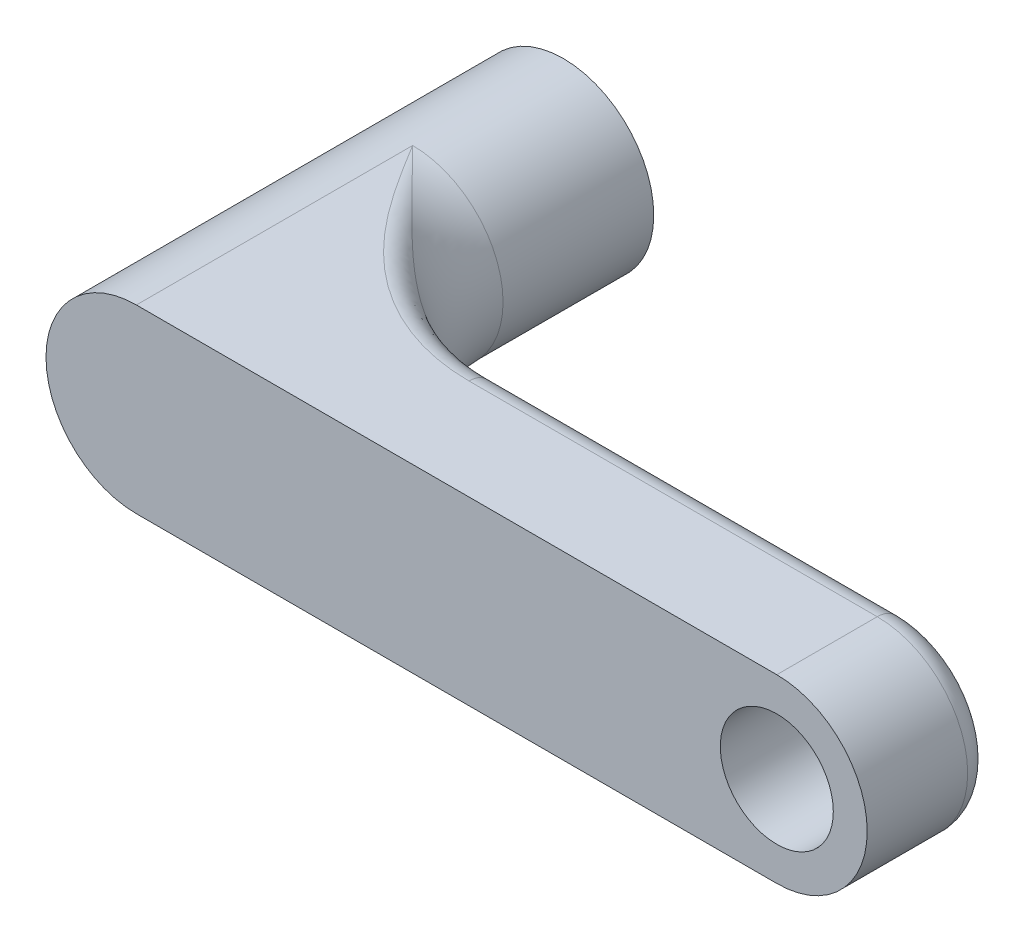
ISO-10303-21;
HEADER;
FILE_DESCRIPTION(('STEP AP214'),'2;1');
FILE_NAME('part.step','',(''),(''),'','','');
FILE_SCHEMA(('AUTOMOTIVE_DESIGN { 1 0 10303 214 1 1 1 1 }'));
ENDSEC;
DATA;
#1=APPLICATION_CONTEXT('core data for automotive mechanical design processes');
#2=APPLICATION_PROTOCOL_DEFINITION('international standard','automotive_design',2000,#1);
#3=PRODUCT_CONTEXT('',#1,'mechanical');
#4=PRODUCT('Part','Part','',(#3));
#5=PRODUCT_RELATED_PRODUCT_CATEGORY('part','',(#4));
#6=PRODUCT_DEFINITION_FORMATION('','',#4);
#7=PRODUCT_DEFINITION_CONTEXT('part definition',#1,'design');
#8=PRODUCT_DEFINITION('design','',#6,#7);
#9=PRODUCT_DEFINITION_SHAPE('','',#8);
#10=(LENGTH_UNIT() NAMED_UNIT(*) SI_UNIT(.MILLI.,.METRE.));
#11=(NAMED_UNIT(*) PLANE_ANGLE_UNIT() SI_UNIT($,.RADIAN.));
#12=(NAMED_UNIT(*) SI_UNIT($,.STERADIAN.) SOLID_ANGLE_UNIT());
#13=UNCERTAINTY_MEASURE_WITH_UNIT(LENGTH_MEASURE(1.E-05),#10,'distance_accuracy_value','');
#14=(GEOMETRIC_REPRESENTATION_CONTEXT(3) GLOBAL_UNCERTAINTY_ASSIGNED_CONTEXT((#13)) GLOBAL_UNIT_ASSIGNED_CONTEXT((#10,
#11,#12)) REPRESENTATION_CONTEXT('',''));
#15=CARTESIAN_POINT('',(0.,0.,0.));
#16=DIRECTION('',(0.,0.,1.));
#17=DIRECTION('',(1.,0.,0.));
#18=AXIS2_PLACEMENT_3D('',#15,#16,#17);
#19=CARTESIAN_POINT('',(0.,0.,17.));
#20=DIRECTION('',(0.,0.,-1.));
#21=DIRECTION('',(-1.,0.,0.));
#22=AXIS2_PLACEMENT_3D('',#19,#20,#21);
#23=CYLINDRICAL_SURFACE('',#22,3.6);
#24=CARTESIAN_POINT('',(0.,0.,0.));
#25=DIRECTION('',(0.,0.,1.));
#26=DIRECTION('',(1.,0.,0.));
#27=AXIS2_PLACEMENT_3D('',#24,#25,#26);
#28=CIRCLE('',#27,3.6);
#29=CARTESIAN_POINT('',(3.6,0.,0.));
#30=VERTEX_POINT('',#29);
#31=EDGE_CURVE('E140',#30,#30,#28,.T.);
#32=ORIENTED_EDGE('',*,*,#31,.T.);
#33=EDGE_LOOP('',(#32));
#34=FACE_BOUND('',#33,.T.);
#35=DIRECTION('',(0.,0.,1.));
#36=VECTOR('',#35,1.);
#37=CARTESIAN_POINT('',(0.,3.6,12.));
#38=LINE('',#37,#36);
#39=CARTESIAN_POINT('',(0.,3.6,6.));
#40=VERTEX_POINT('',#39);
#41=CARTESIAN_POINT('',(0.,3.6,17.));
#42=VERTEX_POINT('',#41);
#43=EDGE_CURVE('E133',#40,#42,#38,.T.);
#44=ORIENTED_EDGE('',*,*,#43,.F.);
#45=CARTESIAN_POINT('',(0.,0.,6.));
#46=DIRECTION('',(0.,0.,1.));
#47=DIRECTION('',(1.,0.,0.));
#48=AXIS2_PLACEMENT_3D('',#45,#46,#47);
#49=CIRCLE('',#48,3.6);
#50=CARTESIAN_POINT('',(0.,-3.6,6.));
#51=VERTEX_POINT('',#50);
#52=EDGE_CURVE('E148',#40,#51,#49,.F.);
#53=ORIENTED_EDGE('',*,*,#52,.T.);
#54=DIRECTION('',(0.,0.,1.));
#55=VECTOR('',#54,1.);
#56=CARTESIAN_POINT('',(0.,-3.6,12.));
#57=LINE('',#56,#55);
#58=CARTESIAN_POINT('',(0.,-3.6,17.));
#59=VERTEX_POINT('',#58);
#60=EDGE_CURVE('E130',#51,#59,#57,.T.);
#61=ORIENTED_EDGE('',*,*,#60,.T.);
#62=CARTESIAN_POINT('',(0.,0.,17.));
#63=DIRECTION('',(0.,0.,1.));
#64=DIRECTION('',(1.,0.,0.));
#65=AXIS2_PLACEMENT_3D('',#62,#63,#64);
#66=CIRCLE('',#65,3.6);
#67=EDGE_CURVE('E121',#42,#59,#66,.T.);
#68=ORIENTED_EDGE('',*,*,#67,.F.);
#69=EDGE_LOOP('',(#44,#53,#61,#68));
#70=FACE_BOUND('',#69,.T.);
#71=ADVANCED_FACE('F37',(#34,#70),#23,.T.);
#72=CARTESIAN_POINT('',(0.,0.,17.));
#73=DIRECTION('',(0.,0.,1.));
#74=DIRECTION('',(1.,0.,0.));
#75=AXIS2_PLACEMENT_3D('',#72,#73,#74);
#76=PLANE('',#75);
#77=CARTESIAN_POINT('',(25.5,0.,17.));
#78=DIRECTION('',(0.,0.,1.));
#79=DIRECTION('',(1.,0.,0.));
#80=AXIS2_PLACEMENT_3D('',#77,#78,#79);
#81=CIRCLE('',#80,2.25);
#82=CARTESIAN_POINT('',(27.75,0.,17.));
#83=VERTEX_POINT('',#82);
#84=EDGE_CURVE('E125',#83,#83,#81,.T.);
#85=ORIENTED_EDGE('',*,*,#84,.F.);
#86=EDGE_LOOP('',(#85));
#87=FACE_BOUND('',#86,.T.);
#88=ORIENTED_EDGE('',*,*,#67,.T.);
#89=DIRECTION('',(1.,0.,0.));
#90=VECTOR('',#89,1.);
#91=CARTESIAN_POINT('',(0.,-3.6,17.));
#92=LINE('',#91,#90);
#93=CARTESIAN_POINT('',(25.5,-3.6,17.));
#94=VERTEX_POINT('',#93);
#95=EDGE_CURVE('E103',#59,#94,#92,.T.);
#96=ORIENTED_EDGE('',*,*,#95,.T.);
#97=CARTESIAN_POINT('',(25.5,0.,17.));
#98=DIRECTION('',(0.,0.,1.));
#99=DIRECTION('',(1.,0.,0.));
#100=AXIS2_PLACEMENT_3D('',#97,#98,#99);
#101=CIRCLE('',#100,3.6);
#102=CARTESIAN_POINT('',(25.5,3.6,17.));
#103=VERTEX_POINT('',#102);
#104=EDGE_CURVE('E112',#94,#103,#101,.T.);
#105=ORIENTED_EDGE('',*,*,#104,.T.);
#106=DIRECTION('',(-1.,0.,0.));
#107=VECTOR('',#106,1.);
#108=CARTESIAN_POINT('',(0.,3.6,17.));
#109=LINE('',#108,#107);
#110=EDGE_CURVE('E109',#103,#42,#109,.T.);
#111=ORIENTED_EDGE('',*,*,#110,.T.);
#112=EDGE_LOOP('',(#88,#96,#105,#111));
#113=FACE_BOUND('',#112,.T.);
#114=ADVANCED_FACE('F119',(#87,#113),#76,.T.);
#115=CARTESIAN_POINT('',(0.,0.,0.));
#116=DIRECTION('',(0.,0.,1.));
#117=DIRECTION('',(1.,0.,0.));
#118=AXIS2_PLACEMENT_3D('',#115,#116,#117);
#119=PLANE('',#118);
#120=CARTESIAN_POINT('',(0.,0.,0.));
#121=DIRECTION('',(0.,0.,-1.));
#122=DIRECTION('',(-1.,0.,0.));
#123=AXIS2_PLACEMENT_3D('',#120,#121,#122);
#124=CIRCLE('',#123,2.125);
#125=CARTESIAN_POINT('',(-2.125,0.,0.));
#126=VERTEX_POINT('',#125);
#127=EDGE_CURVE('E132',#126,#126,#124,.T.);
#128=ORIENTED_EDGE('',*,*,#127,.F.);
#129=EDGE_LOOP('',(#128));
#130=FACE_BOUND('',#129,.T.);
#131=ORIENTED_EDGE('',*,*,#31,.F.);
#132=EDGE_LOOP('',(#131));
#133=FACE_BOUND('',#132,.T.);
#134=ADVANCED_FACE('F278',(#130,#133),#119,.F.);
#135=CARTESIAN_POINT('',(0.,0.,10.));
#136=DIRECTION('',(0.,0.,-1.));
#137=DIRECTION('',(-1.,0.,0.));
#138=AXIS2_PLACEMENT_3D('',#135,#136,#137);
#139=CYLINDRICAL_SURFACE('',#138,2.125);
#140=CARTESIAN_POINT('',(0.,0.,10.));
#141=DIRECTION('',(0.,0.,-1.));
#142=DIRECTION('',(-1.,0.,0.));
#143=AXIS2_PLACEMENT_3D('',#140,#141,#142);
#144=CIRCLE('',#143,2.125);
#145=CARTESIAN_POINT('',(-2.125,0.,10.));
#146=VERTEX_POINT('',#145);
#147=EDGE_CURVE('E137',#146,#146,#144,.T.);
#148=ORIENTED_EDGE('',*,*,#147,.F.);
#149=EDGE_LOOP('',(#148));
#150=FACE_BOUND('',#149,.T.);
#151=ORIENTED_EDGE('',*,*,#127,.T.);
#152=EDGE_LOOP('',(#151));
#153=FACE_BOUND('',#152,.T.);
#154=ADVANCED_FACE('F283',(#150,#153),#139,.F.);
#155=CARTESIAN_POINT('',(0.,0.,10.));
#156=DIRECTION('',(0.,0.,-1.));
#157=DIRECTION('',(-1.,0.,0.));
#158=AXIS2_PLACEMENT_3D('',#155,#156,#157);
#159=PLANE('',#158);
#160=ORIENTED_EDGE('',*,*,#147,.T.);
#161=EDGE_LOOP('',(#160));
#162=FACE_BOUND('',#161,.T.);
#163=ADVANCED_FACE('F227',(#162),#159,.T.);
#164=CARTESIAN_POINT('',(0.,-3.6,12.));
#165=DIRECTION('',(0.,-1.,0.));
#166=DIRECTION('',(0.,0.,-1.));
#167=AXIS2_PLACEMENT_3D('',#164,#165,#166);
#168=PLANE('',#167);
#169=ORIENTED_EDGE('',*,*,#60,.F.);
#170=CARTESIAN_POINT('',(11.6412120417183,-3.6,12.6015371164591));
#171=CARTESIAN_POINT('',(11.2912651128014,-3.6,11.5847507329851));
#172=CARTESIAN_POINT('',(11.3166337319736,-2.52750723873836,11.6584603855364));
#173=CARTESIAN_POINT('',(11.4482937655129,-3.6,12.6679578156769));
#174=CARTESIAN_POINT('',(11.1291071294746,-3.6,11.6459425281579));
#175=CARTESIAN_POINT('',(11.1502197619842,-2.53222750770992,11.715392413507));
#176=CARTESIAN_POINT('',(11.2525716817974,-3.6,12.726160517677));
#177=CARTESIAN_POINT('',(10.9637922565761,-3.6,11.700776460458));
#178=CARTESIAN_POINT('',(10.9813154174639,-2.53723095128361,11.7652804437655));
#179=CARTESIAN_POINT('',(10.8569912389186,-3.6,12.8259613073396));
#180=CARTESIAN_POINT('',(10.6284403417357,-3.6,11.7970608108624));
#181=CARTESIAN_POINT('',(10.6397433170531,-2.54787660266658,11.8508239776751));
#182=CARTESIAN_POINT('',(10.6571339884089,-3.6,12.8675637864313));
#183=CARTESIAN_POINT('',(10.4585366993953,-3.6,11.8385595434334));
#184=CARTESIAN_POINT('',(10.4670765692337,-2.5535186410341,11.8864832454083));
#185=CARTESIAN_POINT('',(10.2552608958121,-3.6,12.9339301047296));
#186=CARTESIAN_POINT('',(10.1155016303926,-3.6,11.9078719973684));
#187=CARTESIAN_POINT('',(10.1196350187709,-2.56549813488844,11.9433686611022));
#188=CARTESIAN_POINT('',(10.0532534328453,-3.6,12.9587446013689));
#189=CARTESIAN_POINT('',(9.94252402811078,-3.6,11.9357864132296));
#190=CARTESIAN_POINT('',(9.94486819225055,-2.57183343065732,11.9646382297191));
#191=CARTESIAN_POINT('',(9.64793000681871,-3.6,12.9917857817084));
#192=CARTESIAN_POINT('',(9.59387983761504,-3.6,11.9780116128161));
#193=CARTESIAN_POINT('',(9.5938942673513,-2.58529660171234,11.9929592414901));
#194=CARTESIAN_POINT('',(9.444613988823,-3.6,13.0000117643709));
#195=CARTESIAN_POINT('',(9.41835929884499,-3.6,11.9923992748455));
#196=CARTESIAN_POINT('',(9.41768710841925,-2.59242451048122,12.0000100837547));
#197=CARTESIAN_POINT('',(8.83483384377437,-3.6,12.9999764958797));
#198=CARTESIAN_POINT('',(8.89127716954358,-3.6,12.0150143944));
#199=CARTESIAN_POINT('',(8.88863124979969,-2.61513512443222,11.9999798535948));
#200=CARTESIAN_POINT('',(8.42811264837613,-3.6,12.9670709300723));
#201=CARTESIAN_POINT('',(8.53577811718981,-3.6,12.0035261501664));
#202=CARTESIAN_POINT('',(8.53498106842948,-2.63205682688977,11.9717750829234));
#203=CARTESIAN_POINT('',(7.62487730077073,-3.6,12.838385798667));
#204=CARTESIAN_POINT('',(7.82438166460575,-3.6,11.926473340687));
#205=CARTESIAN_POINT('',(7.83409683489685,-2.67033265705266,11.8614735417249));
#206=CARTESIAN_POINT('',(7.22836882818254,-3.6,12.7425720002668));
#207=CARTESIAN_POINT('',(7.46978427415438,-3.6,11.8619864766528));
#208=CARTESIAN_POINT('',(7.48686638199672,-2.69168919373504,11.7793474287958));
#209=CARTESIAN_POINT('',(6.4239252948628,-3.6,12.4833214447656));
#210=CARTESIAN_POINT('',(6.73954607399357,-3.6,11.6740886579743));
#211=CARTESIAN_POINT('',(6.77832319923892,-2.74175144424244,11.5571326669465));
#212=CARTESIAN_POINT('',(6.01750243782565,-3.6,12.3152023195919));
#213=CARTESIAN_POINT('',(6.36535616115251,-3.6,11.5480910826563));
#214=CARTESIAN_POINT('',(6.41801754417853,-2.77089975161888,11.4130305596814));
#215=CARTESIAN_POINT('',(5.23459827002132,-3.6,11.919973236659));
#216=CARTESIAN_POINT('',(5.62977395264859,-3.6,11.2394549136101));
#217=CARTESIAN_POINT('',(5.71647677637085,-2.83688604075511,11.0742627742844));
#218=CARTESIAN_POINT('',(4.85812405903247,-3.6,11.6928493450441));
#219=CARTESIAN_POINT('',(5.26992355997416,-3.6,11.0591013379251));
#220=CARTESIAN_POINT('',(5.37524619132276,-2.87372583844066,10.8795851528479));
#221=CARTESIAN_POINT('',(4.23856373501726,-3.6,11.2587545818777));
#222=CARTESIAN_POINT('',(4.66153658264882,-3.6,10.7024223473949));
#223=CARTESIAN_POINT('',(4.80324893832798,-2.94455369864078,10.5075039273579));
#224=CARTESIAN_POINT('',(3.98721617272842,-3.6,11.0633457948435));
#225=CARTESIAN_POINT('',(4.41196237680684,-3.6,10.5408209750544));
#226=CARTESIAN_POINT('',(4.56785721558966,-2.97655195738627,10.3400106814151));
#227=CARTESIAN_POINT('',(3.50308874934244,-3.6,10.6505994635073));
#228=CARTESIAN_POINT('',(3.92292499212783,-3.6,10.1935983868694));
#229=CARTESIAN_POINT('',(4.10553017674361,-3.04478027454322,9.9862281116887));
#230=CARTESIAN_POINT('',(3.27031682107747,-3.6,10.4332526392295));
#231=CARTESIAN_POINT('',(3.68372550515986,-3.6,10.0088880422756));
#232=CARTESIAN_POINT('',(3.87859849535623,-3.08101212483007,9.79993083363999));
#233=CARTESIAN_POINT('',(2.82264474579318,-3.6,9.98040297096917));
#234=CARTESIAN_POINT('',(3.21561514967119,-3.6,9.61828272177543));
#235=CARTESIAN_POINT('',(3.43028102863137,-3.1567054648508,9.41177397510173));
#236=CARTESIAN_POINT('',(2.60777073969791,-3.6,9.74487450592369));
#237=CARTESIAN_POINT('',(2.98671490683455,-3.6,9.41307946637038));
#238=CARTESIAN_POINT('',(3.20890367416878,-3.19617151713573,9.20989243370131));
#239=CARTESIAN_POINT('',(2.19464881792116,-3.6,9.25983355437357));
#240=CARTESIAN_POINT('',(2.53926687584139,-3.6,8.98521273501958));
#241=CARTESIAN_POINT('',(2.76838754457269,-3.27596486263584,8.79414304667419));
#242=CARTESIAN_POINT('',(1.99639838653591,-3.6,9.01032319336727));
#243=CARTESIAN_POINT('',(2.32038858670714,-3.6,8.76288850920592));
#244=CARTESIAN_POINT('',(2.54924843514175,-3.31629202437319,8.58027702290321));
#245=CARTESIAN_POINT('',(1.64120125811175,-3.6,8.53729477137819));
#246=CARTESIAN_POINT('',(1.92200834941239,-3.6,8.33687400387407));
#247=CARTESIAN_POINT('',(2.1409522526286,-3.38837575776188,8.17482408973818));
#248=CARTESIAN_POINT('',(1.48239949195397,-3.6,8.31515420588447));
#249=CARTESIAN_POINT('',(1.7413906393472,-3.6,8.13545298202036));
#250=CARTESIAN_POINT('',(1.95198327355678,-3.42053378517336,7.98441789075422));
#251=CARTESIAN_POINT('',(1.17311047645076,-3.6,7.8655960482988));
#252=CARTESIAN_POINT('',(1.38619920261624,-3.6,7.72570977142303));
#253=CARTESIAN_POINT('',(1.57162800523901,-3.47937578101068,7.59908232711715));
#254=CARTESIAN_POINT('',(1.02261326902235,-3.6,7.6381852620691));
#255=CARTESIAN_POINT('',(1.21094996811423,-3.6,7.51684217741283));
#256=CARTESIAN_POINT('',(1.38024496480471,-3.50606641445934,7.40415879606027));
#257=CARTESIAN_POINT('',(0.726742216698949,-3.6,7.17896301466725));
#258=CARTESIAN_POINT('',(0.864340906581319,-3.6,7.09406183847125));
#259=CARTESIAN_POINT('',(0.993775974669483,-3.55076616775441,7.0105397268566));
#260=CARTESIAN_POINT('',(0.581388107061622,-3.6,6.94713895516303));
#261=CARTESIAN_POINT('',(0.69211876155406,-3.6,6.87917605407218));
#262=CARTESIAN_POINT('',(0.798679424581684,-3.56874463292702,6.81183339013947));
#263=CARTESIAN_POINT('',(0.29358144924814,-3.6,6.48164549304636));
#264=CARTESIAN_POINT('',(0.35055500340188,-3.6,6.44790584017823));
#265=CARTESIAN_POINT('',(0.406418984095753,-3.59323222815295,6.41283899404));
#266=CARTESIAN_POINT('',(0.151129509375175,-3.6,6.24797571752396));
#267=CARTESIAN_POINT('',(0.180203095904452,-3.6,6.23027632014203));
#268=CARTESIAN_POINT('',(0.209254673144227,-3.59973897765836,6.21255061502054));
#269=CARTESIAN_POINT('',(0.0058054885505426,-3.6,6.00952579316415));
#270=CARTESIAN_POINT('',(0.00692193721074341,-3.6,6.00884539275747));
#271=CARTESIAN_POINT('',(0.00803837448457479,-3.59999747097945,6.00816496556927));
#272=CARTESIAN_POINT('',(0.00290274398119086,-3.6,6.00476289643463));
#273=CARTESIAN_POINT('',(0.00346096827214912,-3.6,6.00442269758404));
#274=CARTESIAN_POINT('',(0.00401918990586023,-3.60000003652135,6.00408248265826));
#275=CARTESIAN_POINT('',(0.,-3.6,6.));
#276=CARTESIAN_POINT('',(0.,-3.6,6.));
#277=CARTESIAN_POINT('',(0.,-3.6,6.));
#278=(BOUNDED_SURFACE() B_SPLINE_SURFACE(3,2,((#170,#171,#172),(#173,#174,#175),(#176,#177,
#178),(#179,#180,#181),(#182,#183,#184),(#185,#186,#187),(#188,#189,#190),(#191,#192,#193),
(#194,#195,#196),(#197,#198,#199),(#200,#201,#202),(#203,#204,#205),(#206,#207,#208),(#209,#210,
#211),(#212,#213,#214),(#215,#216,#217),(#218,#219,#220),(#221,#222,#223),(#224,#225,#226),
(#227,#228,#229),(#230,#231,#232),(#233,#234,#235),(#236,#237,#238),(#239,#240,#241),(#242,#243,
#244),(#245,#246,#247),(#248,#249,#250),(#251,#252,#253),(#254,#255,#256),(#257,#258,#259),
(#260,#261,#262),(#263,#264,#265),(#266,#267,#268),(#269,#270,#271),(#272,#273,#274),(#275,#276,
#277)),.UNSPECIFIED.,.F.,.F.,.F.) B_SPLINE_SURFACE_WITH_KNOTS((4,2,2,2,2,2,2,2,2,2,2,2,2,2,2,2,
2,4),(3,3),(0.,0.611876128867008,1.22359028430795,1.83345027086995,2.44333602983645,
3.66183112886795,4.88098984711946,6.19502796610971,7.50937667504031,8.46318512461765,
9.41739874774759,10.3729824697153,11.3284213178725,12.1473977405228,12.9653697698198,
13.786199389849,14.6071993239279,14.6239325244586),(0.,1.),
.UNSPECIFIED.) GEOMETRIC_REPRESENTATION_ITEM() RATIONAL_B_SPLINE_SURFACE(((1.,0.680994581013081,
1.),(1.,0.682727209185336,1.),(1.,0.684557631714779,1.),(1.,0.688434558323677,1.),(1.,
0.690481005074613,1.),(1.,0.69480480515907,1.),(1.,0.697081439788944,1.),(1.,0.701893196281024,
1.),(1.,0.704428329062716,1.),(1.,0.712458079750084,1.),(1.,0.718381456508078,1.),(1.,
0.73158043402025,1.),(1.,0.738856769468396,1.),(1.,0.755613397418577,1.),(1.,0.765221140645199,
1.),(1.,0.786483016770302,1.),(1.,0.798137632822745,1.),(1.,0.819976060656735,1.),(1.,
0.829686361058553,1.),(1.,0.849995820714118,1.),(1.,0.860595355798884,1.),(1.,0.882309572248317,
1.),(1.,0.893424971428611,1.),(1.,0.915479774597461,1.),(1.,0.92641920501275,1.),(1.,
0.945657115723121,1.),(1.,0.954109635541874,1.),(1.,0.96940526318967,1.),(1.,0.976250332089803,
1.),(1.,0.987631687780218,1.),(1.,0.992159825283573,1.),(1.,0.998311692059242,1.),(1.,
0.999934818500551,1.),(1.,0.999999366232993,1.),(1.,1.0000000075569,1.),(1.,1.,1.))) REPRESENTATION_ITEM('') SURFACE());
#279=CARTESIAN_POINT('',(11.6412120417183,-3.6,12.6015371164591));
#280=CARTESIAN_POINT('',(11.4482937655129,-3.6,12.6679578156769));
#281=CARTESIAN_POINT('',(11.2525716817974,-3.6,12.726160517677));
#282=CARTESIAN_POINT('',(10.8569912389186,-3.6,12.8259613073396));
#283=CARTESIAN_POINT('',(10.6571339884089,-3.6,12.8675637864313));
#284=CARTESIAN_POINT('',(10.2552608958121,-3.6,12.9339301047296));
#285=CARTESIAN_POINT('',(10.0532534328453,-3.6,12.9587446013689));
#286=CARTESIAN_POINT('',(9.64793000681871,-3.6,12.9917857817084));
#287=CARTESIAN_POINT('',(9.444613988823,-3.6,13.0000117643709));
#288=CARTESIAN_POINT('',(8.83483384377436,-3.6,12.9999764958797));
#289=CARTESIAN_POINT('',(8.42811264837613,-3.6,12.9670709300723));
#290=CARTESIAN_POINT('',(7.62487730077073,-3.6,12.838385798667));
#291=CARTESIAN_POINT('',(7.22836882818254,-3.6,12.7425720002668));
#292=CARTESIAN_POINT('',(6.4239252948628,-3.6,12.4833214447656));
#293=CARTESIAN_POINT('',(6.01750243782565,-3.6,12.3152023195919));
#294=CARTESIAN_POINT('',(5.23459827002132,-3.6,11.919973236659));
#295=CARTESIAN_POINT('',(4.85812405903246,-3.6,11.6928493450441));
#296=CARTESIAN_POINT('',(4.23856373501726,-3.6,11.2587545818777));
#297=CARTESIAN_POINT('',(3.98721617272842,-3.6,11.0633457948435));
#298=CARTESIAN_POINT('',(3.50308874934244,-3.6,10.6505994635074));
#299=CARTESIAN_POINT('',(3.27031682107747,-3.6,10.4332526392295));
#300=CARTESIAN_POINT('',(2.82264474579318,-3.6,9.98040297096917));
#301=CARTESIAN_POINT('',(2.60777073969791,-3.6,9.74487450592369));
#302=CARTESIAN_POINT('',(2.19464881792116,-3.6,9.25983355437357));
#303=CARTESIAN_POINT('',(1.99639838653591,-3.6,9.01032319336727));
#304=CARTESIAN_POINT('',(1.64120125811175,-3.6,8.53729477137819));
#305=CARTESIAN_POINT('',(1.48239949195397,-3.6,8.31515420588447));
#306=CARTESIAN_POINT('',(1.17311047645076,-3.6,7.8655960482988));
#307=CARTESIAN_POINT('',(1.02261326902235,-3.6,7.6381852620691));
#308=CARTESIAN_POINT('',(0.726742216698948,-3.6,7.17896301466725));
#309=CARTESIAN_POINT('',(0.581388107061622,-3.6,6.94713895516302));
#310=CARTESIAN_POINT('',(0.293581449248141,-3.6,6.48164549304636));
#311=CARTESIAN_POINT('',(0.151129509375177,-3.6,6.24797571752397));
#312=CARTESIAN_POINT('',(0.0058054885505426,-3.6,6.00952579316415));
#313=CARTESIAN_POINT('',(0.00290274398119086,-3.6,6.00476289643463));
#314=CARTESIAN_POINT('',(0.,-3.6,6.));
#315=B_SPLINE_CURVE_WITH_KNOTS('',3,(#279,#280,#281,#282,#283,#284,#285,#286,#287,#288,#289,
#290,#291,#292,#293,#294,#295,#296,#297,#298,#299,#300,#301,#302,#303,#304,#305,#306,#307,#308,
#309,#310,#311,#312,#313,#314),.UNSPECIFIED.,.F.,.F.,(4,2,2,2,2,2,2,2,2,2,2,2,2,2,2,2,2,4),(0.,
0.611876128867008,1.22359028430795,1.83345027086995,2.44333602983645,3.66183112886795,
4.88098984711946,6.19502796610971,7.50937667504031,8.46318512461765,9.41739874774759,
10.3729824697153,11.3284213178725,12.1473977405228,12.9653697698198,13.786199389849,
14.6071993239279,14.6239325244586),.UNSPECIFIED.);
#316=CARTESIAN_POINT('',(9.24121204171834,-3.6,13.));
#317=VERTEX_POINT('',#316);
#318=EDGE_CURVE('E11',#51,#317,#315,.F.);
#319=ORIENTED_EDGE('',*,*,#318,.T.);
#320=DIRECTION('',(1.,0.,0.));
#321=VECTOR('',#320,1.);
#322=CARTESIAN_POINT('',(25.5,-3.6,13.));
#323=LINE('',#322,#321);
#324=CARTESIAN_POINT('',(25.5,-3.6,13.));
#325=VERTEX_POINT('',#324);
#326=EDGE_CURVE('E49',#317,#325,#323,.T.);
#327=ORIENTED_EDGE('',*,*,#326,.T.);
#328=DIRECTION('',(0.,0.,1.));
#329=VECTOR('',#328,1.);
#330=CARTESIAN_POINT('',(25.5,-3.6,12.));
#331=LINE('',#330,#329);
#332=EDGE_CURVE('E99',#325,#94,#331,.T.);
#333=ORIENTED_EDGE('',*,*,#332,.T.);
#334=ORIENTED_EDGE('',*,*,#95,.F.);
#335=EDGE_LOOP('',(#169,#319,#327,#333,#334));
#336=FACE_BOUND('',#335,.T.);
#337=ADVANCED_FACE('F101',(#336),#168,.T.);
#338=CARTESIAN_POINT('',(0.,3.6,12.));
#339=DIRECTION('',(0.,1.,0.));
#340=DIRECTION('',(-1.,0.,0.));
#341=AXIS2_PLACEMENT_3D('',#338,#339,#340);
#342=PLANE('',#341);
#343=DIRECTION('',(-1.,0.,0.));
#344=VECTOR('',#343,1.);
#345=CARTESIAN_POINT('',(8.89943818451479,3.6,13.));
#346=LINE('',#345,#344);
#347=CARTESIAN_POINT('',(25.5,3.6,13.));
#348=VERTEX_POINT('',#347);
#349=CARTESIAN_POINT('',(9.24121204171834,3.6,13.));
#350=VERTEX_POINT('',#349);
#351=EDGE_CURVE('E151',#348,#350,#346,.T.);
#352=ORIENTED_EDGE('',*,*,#351,.T.);
#353=CARTESIAN_POINT('',(11.3166337319736,2.52750723873836,11.6584603855364));
#354=CARTESIAN_POINT('',(11.2912651128014,3.6,11.5847507329851));
#355=CARTESIAN_POINT('',(11.6412120417183,3.6,12.6015371164591));
#356=CARTESIAN_POINT('',(11.1502197619842,2.53222750770992,11.715392413507));
#357=CARTESIAN_POINT('',(11.1291071294746,3.6,11.6459425281579));
#358=CARTESIAN_POINT('',(11.4482937655129,3.6,12.6679578156769));
#359=CARTESIAN_POINT('',(10.9813154174639,2.53723095128361,11.7652804437655));
#360=CARTESIAN_POINT('',(10.9637922565761,3.6,11.700776460458));
#361=CARTESIAN_POINT('',(11.2525716817974,3.6,12.726160517677));
#362=CARTESIAN_POINT('',(10.639743317053,2.54787660266658,11.8508239776751));
#363=CARTESIAN_POINT('',(10.6284403417357,3.6,11.7970608108624));
#364=CARTESIAN_POINT('',(10.8569912389186,3.6,12.8259613073396));
#365=CARTESIAN_POINT('',(10.4670765692337,2.55351864103411,11.8864832454083));
#366=CARTESIAN_POINT('',(10.4585366993953,3.6,11.8385595434334));
#367=CARTESIAN_POINT('',(10.6571339884089,3.6,12.8675637864313));
#368=CARTESIAN_POINT('',(10.1196350187709,2.56549813488844,11.9433686611022));
#369=CARTESIAN_POINT('',(10.1155016303925,3.6,11.9078719973684));
#370=CARTESIAN_POINT('',(10.2552608958121,3.6,12.9339301047296));
#371=CARTESIAN_POINT('',(9.94486819225054,2.57183343065732,11.9646382297191));
#372=CARTESIAN_POINT('',(9.94252402811077,3.6,11.9357864132296));
#373=CARTESIAN_POINT('',(10.0532534328453,3.6,12.9587446013689));
#374=CARTESIAN_POINT('',(9.5938942673513,2.58529660171234,11.9929592414901));
#375=CARTESIAN_POINT('',(9.59387983761504,3.6,11.9780116128161));
#376=CARTESIAN_POINT('',(9.64793000681871,3.6,12.9917857817084));
#377=CARTESIAN_POINT('',(9.41768710841924,2.59242451048122,12.0000100837547));
#378=CARTESIAN_POINT('',(9.41835929884499,3.6,11.9923992748455));
#379=CARTESIAN_POINT('',(9.444613988823,3.6,13.0000117643709));
#380=CARTESIAN_POINT('',(8.88863124979969,2.61513512443222,11.9999798535948));
#381=CARTESIAN_POINT('',(8.89127716954359,3.6,12.0150143944));
#382=CARTESIAN_POINT('',(8.83483384377437,3.6,12.9999764958797));
#383=CARTESIAN_POINT('',(8.53498106842949,2.63205682688977,11.9717750829234));
#384=CARTESIAN_POINT('',(8.53577811718982,3.6,12.0035261501664));
#385=CARTESIAN_POINT('',(8.42811264837613,3.6,12.9670709300723));
#386=CARTESIAN_POINT('',(7.83409683489685,2.67033265705267,11.8614735417249));
#387=CARTESIAN_POINT('',(7.82438166460576,3.6,11.926473340687));
#388=CARTESIAN_POINT('',(7.62487730077074,3.6,12.838385798667));
#389=CARTESIAN_POINT('',(7.48686638199672,2.69168919373504,11.7793474287958));
#390=CARTESIAN_POINT('',(7.46978427415439,3.6,11.8619864766528));
#391=CARTESIAN_POINT('',(7.22836882818255,3.6,12.7425720002668));
#392=CARTESIAN_POINT('',(6.77832319923891,2.74175144424244,11.5571326669465));
#393=CARTESIAN_POINT('',(6.73954607399356,3.6,11.6740886579743));
#394=CARTESIAN_POINT('',(6.4239252948628,3.6,12.4833214447656));
#395=CARTESIAN_POINT('',(6.41801754417852,2.77089975161888,11.4130305596814));
#396=CARTESIAN_POINT('',(6.36535616115249,3.6,11.5480910826563));
#397=CARTESIAN_POINT('',(6.01750243782564,3.6,12.3152023195919));
#398=CARTESIAN_POINT('',(5.71647677637084,2.83688604075511,11.0742627742844));
#399=CARTESIAN_POINT('',(5.62977395264857,3.6,11.2394549136101));
#400=CARTESIAN_POINT('',(5.2345982700213,3.6,11.919973236659));
#401=CARTESIAN_POINT('',(5.37524619132275,2.87372583844066,10.8795851528479));
#402=CARTESIAN_POINT('',(5.26992355997415,3.6,11.0591013379251));
#403=CARTESIAN_POINT('',(4.85812405903246,3.6,11.6928493450441));
#404=CARTESIAN_POINT('',(4.80324893832799,2.94455369864078,10.5075039273579));
#405=CARTESIAN_POINT('',(4.66153658264883,3.6,10.7024223473949));
#406=CARTESIAN_POINT('',(4.23856373501727,3.6,11.2587545818777));
#407=CARTESIAN_POINT('',(4.56785721558968,2.97655195738627,10.3400106814151));
#408=CARTESIAN_POINT('',(4.41196237680686,3.6,10.5408209750545));
#409=CARTESIAN_POINT('',(3.98721617272844,3.6,11.0633457948435));
#410=CARTESIAN_POINT('',(4.10553017674365,3.04478027454321,9.98622811168873));
#411=CARTESIAN_POINT('',(3.92292499212786,3.6,10.1935983868694));
#412=CARTESIAN_POINT('',(3.50308874934247,3.6,10.6505994635074));
#413=CARTESIAN_POINT('',(3.87859849535627,3.08101212483007,9.79993083364002));
#414=CARTESIAN_POINT('',(3.6837255051599,3.6,10.0088880422756));
#415=CARTESIAN_POINT('',(3.27031682107751,3.6,10.4332526392296));
#416=CARTESIAN_POINT('',(3.43028102863141,3.15670546485079,9.41177397510176));
#417=CARTESIAN_POINT('',(3.21561514967123,3.6,9.61828272177546));
#418=CARTESIAN_POINT('',(2.82264474579322,3.6,9.98040297096921));
#419=CARTESIAN_POINT('',(3.20890367416881,3.19617151713572,9.20989243370134));
#420=CARTESIAN_POINT('',(2.98671490683458,3.6,9.41307946637041));
#421=CARTESIAN_POINT('',(2.60777073969794,3.6,9.74487450592372));
#422=CARTESIAN_POINT('',(2.76838754457269,3.27596486263584,8.7941430466742));
#423=CARTESIAN_POINT('',(2.5392668758414,3.6,8.98521273501959));
#424=CARTESIAN_POINT('',(2.19464881792117,3.6,9.25983355437359));
#425=CARTESIAN_POINT('',(2.54924843514173,3.31629202437319,8.58027702290323));
#426=CARTESIAN_POINT('',(2.32038858670711,3.6,8.76288850920594));
#427=CARTESIAN_POINT('',(1.9963983865359,3.6,9.01032319336729));
#428=CARTESIAN_POINT('',(2.14095225262862,3.38837575776188,8.17482408973816));
#429=CARTESIAN_POINT('',(1.9220083494124,3.6,8.33687400387405));
#430=CARTESIAN_POINT('',(1.64120125811177,3.6,8.53729477137817));
#431=CARTESIAN_POINT('',(1.95198327355686,3.42053378517337,7.98441789075417));
#432=CARTESIAN_POINT('',(1.74139063934727,3.6,8.13545298202031));
#433=CARTESIAN_POINT('',(1.48239949195402,3.6,8.31515420588441));
#434=CARTESIAN_POINT('',(1.57162800523891,3.47937578101068,7.59908232711717));
#435=CARTESIAN_POINT('',(1.38619920261615,3.6,7.72570977142306));
#436=CARTESIAN_POINT('',(1.17311047645069,3.6,7.86559604829883));
#437=CARTESIAN_POINT('',(1.38024496480437,3.50606641445934,7.40415879606038));
#438=CARTESIAN_POINT('',(1.21094996811394,3.6,7.51684217741296));
#439=CARTESIAN_POINT('',(1.02261326902211,3.6,7.63818526206923));
#440=CARTESIAN_POINT('',(0.993775974669821,3.55076616775441,7.01053972685647));
#441=CARTESIAN_POINT('',(0.864340906581614,3.6,7.09406183847111));
#442=CARTESIAN_POINT('',(0.726742216699193,3.6,7.1789630146671));
#443=CARTESIAN_POINT('',(0.798679424582933,3.56874463292702,6.811833390139));
#444=CARTESIAN_POINT('',(0.692118761555144,3.6,6.87917605407166));
#445=CARTESIAN_POINT('',(0.581388107062524,3.6,6.94713895516247));
#446=CARTESIAN_POINT('',(0.40641898409448,3.59323222815295,6.41283899404049));
#447=CARTESIAN_POINT('',(0.35055500340078,3.6,6.44790584017876));
#448=CARTESIAN_POINT('',(0.29358144924722,3.6,6.48164549304693));
#449=CARTESIAN_POINT('',(0.209254673139518,3.59973897765836,6.21255061502234));
#450=CARTESIAN_POINT('',(0.180203095900397,3.6,6.23027632014398));
#451=CARTESIAN_POINT('',(0.151129509371774,3.6,6.24797571752605));
#452=CARTESIAN_POINT('',(0.00803837448438481,3.59999747097945,6.00816496556935));
#453=CARTESIAN_POINT('',(0.00692193721057976,3.6,6.00884539275755));
#454=CARTESIAN_POINT('',(0.00580548855040527,3.6,6.00952579316424));
#455=CARTESIAN_POINT('',(0.00401918990576335,3.60000003652135,6.00408248265829));
#456=CARTESIAN_POINT('',(0.00346096827206564,3.6,6.00442269758408));
#457=CARTESIAN_POINT('',(0.00290274398112078,3.6,6.00476289643468));
#458=CARTESIAN_POINT('',(0.,3.6,6.));
#459=CARTESIAN_POINT('',(0.,3.6,6.));
#460=CARTESIAN_POINT('',(0.,3.6,6.));
#461=(BOUNDED_SURFACE() B_SPLINE_SURFACE(3,2,((#353,#354,#355),(#356,#357,#358),(#359,#360,
#361),(#362,#363,#364),(#365,#366,#367),(#368,#369,#370),(#371,#372,#373),(#374,#375,#376),
(#377,#378,#379),(#380,#381,#382),(#383,#384,#385),(#386,#387,#388),(#389,#390,#391),(#392,#393,
#394),(#395,#396,#397),(#398,#399,#400),(#401,#402,#403),(#404,#405,#406),(#407,#408,#409),
(#410,#411,#412),(#413,#414,#415),(#416,#417,#418),(#419,#420,#421),(#422,#423,#424),(#425,#426,
#427),(#428,#429,#430),(#431,#432,#433),(#434,#435,#436),(#437,#438,#439),(#440,#441,#442),
(#443,#444,#445),(#446,#447,#448),(#449,#450,#451),(#452,#453,#454),(#455,#456,#457),(#458,#459,
#460)),.UNSPECIFIED.,.F.,.F.,.F.) B_SPLINE_SURFACE_WITH_KNOTS((4,2,2,2,2,2,2,2,2,2,2,2,2,2,2,2,
2,4),(3,3),(0.,0.611876128867016,1.22359028430796,1.83345027086996,2.44333602983645,
3.66183112886794,4.88098984711946,6.19502796610974,7.50937667504031,8.46318512461761,
9.41739874774752,10.3729824697153,11.3284213178725,12.1473977405228,12.9653697698198,
13.786199389849,14.6071993239279,14.6239325244586),(0.,1.),
.UNSPECIFIED.) GEOMETRIC_REPRESENTATION_ITEM() RATIONAL_B_SPLINE_SURFACE(((1.,0.680994581013081,
1.),(1.,0.682727209185336,1.),(1.,0.684557631714779,1.),(1.,0.688434558323677,1.),(1.,
0.690481005074613,1.),(1.,0.69480480515907,1.),(1.,0.697081439788944,1.),(1.,0.701893196281024,
1.),(1.,0.704428329062716,1.),(1.,0.712458079750084,1.),(1.,0.718381456508078,1.),(1.,
0.73158043402025,1.),(1.,0.738856769468395,1.),(1.,0.755613397418577,1.),(1.,0.765221140645199,
1.),(1.,0.786483016770302,1.),(1.,0.798137632822745,1.),(1.,0.819976060656734,1.),(1.,
0.829686361058552,1.),(1.,0.849995820714117,1.),(1.,0.860595355798882,1.),(1.,0.882309572248315,
1.),(1.,0.893424971428609,1.),(1.,0.91547977459746,1.),(1.,0.92641920501275,1.),(1.,
0.945657115723122,1.),(1.,0.954109635541875,1.),(1.,0.969405263189671,1.),(1.,0.976250332089803,
1.),(1.,0.987631687780218,1.),(1.,0.992159825283572,1.),(1.,0.998311692059242,1.),(1.,
0.999934818500553,1.),(1.,0.999999366232993,1.),(1.,1.0000000075569,1.),(1.,1.,1.))) REPRESENTATION_ITEM('') SURFACE());
#462=CARTESIAN_POINT('',(11.6412120417183,3.6,12.6015371164591));
#463=CARTESIAN_POINT('',(11.4482937655129,3.6,12.6679578156769));
#464=CARTESIAN_POINT('',(11.2525716817974,3.6,12.726160517677));
#465=CARTESIAN_POINT('',(10.8569912389186,3.6,12.8259613073396));
#466=CARTESIAN_POINT('',(10.6571339884089,3.6,12.8675637864313));
#467=CARTESIAN_POINT('',(10.2552608958121,3.6,12.9339301047296));
#468=CARTESIAN_POINT('',(10.0532534328453,3.6,12.9587446013689));
#469=CARTESIAN_POINT('',(9.64793000681871,3.6,12.9917857817084));
#470=CARTESIAN_POINT('',(9.444613988823,3.6,13.0000117643709));
#471=CARTESIAN_POINT('',(8.83483384377437,3.6,12.9999764958797));
#472=CARTESIAN_POINT('',(8.42811264837613,3.6,12.9670709300723));
#473=CARTESIAN_POINT('',(7.62487730077074,3.6,12.838385798667));
#474=CARTESIAN_POINT('',(7.22836882818255,3.6,12.7425720002668));
#475=CARTESIAN_POINT('',(6.4239252948628,3.6,12.4833214447656));
#476=CARTESIAN_POINT('',(6.01750243782564,3.6,12.3152023195919));
#477=CARTESIAN_POINT('',(5.2345982700213,3.6,11.919973236659));
#478=CARTESIAN_POINT('',(4.85812405903246,3.6,11.6928493450441));
#479=CARTESIAN_POINT('',(4.23856373501727,3.6,11.2587545818777));
#480=CARTESIAN_POINT('',(3.98721617272844,3.6,11.0633457948435));
#481=CARTESIAN_POINT('',(3.50308874934247,3.6,10.6505994635074));
#482=CARTESIAN_POINT('',(3.27031682107751,3.6,10.4332526392296));
#483=CARTESIAN_POINT('',(2.82264474579322,3.6,9.98040297096921));
#484=CARTESIAN_POINT('',(2.60777073969794,3.6,9.74487450592372));
#485=CARTESIAN_POINT('',(2.19464881792117,3.6,9.25983355437359));
#486=CARTESIAN_POINT('',(1.9963983865359,3.6,9.01032319336729));
#487=CARTESIAN_POINT('',(1.64120125811177,3.6,8.53729477137817));
#488=CARTESIAN_POINT('',(1.48239949195402,3.6,8.31515420588441));
#489=CARTESIAN_POINT('',(1.17311047645069,3.6,7.86559604829883));
#490=CARTESIAN_POINT('',(1.02261326902211,3.6,7.63818526206924));
#491=CARTESIAN_POINT('',(0.726742216699193,3.6,7.1789630146671));
#492=CARTESIAN_POINT('',(0.581388107062523,3.6,6.94713895516247));
#493=CARTESIAN_POINT('',(0.29358144924722,3.6,6.48164549304693));
#494=CARTESIAN_POINT('',(0.151129509371777,3.6,6.24797571752606));
#495=CARTESIAN_POINT('',(0.00580548855040527,3.6,6.00952579316424));
#496=CARTESIAN_POINT('',(0.00290274398112078,3.6,6.00476289643468));
#497=CARTESIAN_POINT('',(0.,3.6,6.));
#498=B_SPLINE_CURVE_WITH_KNOTS('',3,(#462,#463,#464,#465,#466,#467,#468,#469,#470,#471,#472,
#473,#474,#475,#476,#477,#478,#479,#480,#481,#482,#483,#484,#485,#486,#487,#488,#489,#490,#491,
#492,#493,#494,#495,#496,#497),.UNSPECIFIED.,.F.,.F.,(4,2,2,2,2,2,2,2,2,2,2,2,2,2,2,2,2,4),(0.,
0.611876128867016,1.22359028430796,1.83345027086996,2.44333602983645,3.66183112886794,
4.88098984711946,6.19502796610974,7.50937667504031,8.46318512461761,9.41739874774752,
10.3729824697153,11.3284213178725,12.1473977405228,12.9653697698198,13.786199389849,
14.6071993239279,14.6239325244586),.UNSPECIFIED.);
#499=EDGE_CURVE('E153',#350,#40,#498,.T.);
#500=ORIENTED_EDGE('',*,*,#499,.T.);
#501=ORIENTED_EDGE('',*,*,#43,.T.);
#502=ORIENTED_EDGE('',*,*,#110,.F.);
#503=DIRECTION('',(0.,0.,1.));
#504=VECTOR('',#503,1.);
#505=CARTESIAN_POINT('',(25.5,3.6,12.));
#506=LINE('',#505,#504);
#507=EDGE_CURVE('E108',#348,#103,#506,.T.);
#508=ORIENTED_EDGE('',*,*,#507,.F.);
#509=EDGE_LOOP('',(#352,#500,#501,#502,#508));
#510=FACE_BOUND('',#509,.T.);
#511=ADVANCED_FACE('F170',(#510),#342,.T.);
#512=CARTESIAN_POINT('',(25.5,0.,12.));
#513=DIRECTION('',(0.,0.,1.));
#514=DIRECTION('',(1.,0.,0.));
#515=AXIS2_PLACEMENT_3D('',#512,#513,#514);
#516=CYLINDRICAL_SURFACE('',#515,3.6);
#517=ORIENTED_EDGE('',*,*,#332,.F.);
#518=CARTESIAN_POINT('',(25.5,0.,13.));
#519=DIRECTION('',(0.,0.,1.));
#520=DIRECTION('',(1.,0.,0.));
#521=AXIS2_PLACEMENT_3D('',#518,#519,#520);
#522=CIRCLE('',#521,3.6);
#523=EDGE_CURVE('E240',#325,#348,#522,.T.);
#524=ORIENTED_EDGE('',*,*,#523,.T.);
#525=ORIENTED_EDGE('',*,*,#507,.T.);
#526=ORIENTED_EDGE('',*,*,#104,.F.);
#527=EDGE_LOOP('',(#517,#524,#525,#526));
#528=FACE_BOUND('',#527,.T.);
#529=ADVANCED_FACE('F113',(#528),#516,.T.);
#530=CARTESIAN_POINT('',(0.,0.,12.));
#531=DIRECTION('',(0.,0.,1.));
#532=DIRECTION('',(1.,0.,0.));
#533=AXIS2_PLACEMENT_3D('',#530,#531,#532);
#534=PLANE('',#533);
#535=CARTESIAN_POINT('',(25.5,0.,12.));
#536=DIRECTION('',(0.,0.,1.));
#537=DIRECTION('',(1.,0.,0.));
#538=AXIS2_PLACEMENT_3D('',#535,#536,#537);
#539=CIRCLE('',#538,2.25);
#540=CARTESIAN_POINT('',(27.75,0.,12.));
#541=VERTEX_POINT('',#540);
#542=EDGE_CURVE('E122',#541,#541,#539,.T.);
#543=ORIENTED_EDGE('',*,*,#542,.T.);
#544=EDGE_LOOP('',(#543));
#545=FACE_BOUND('',#544,.T.);
#546=CARTESIAN_POINT('',(0.,0.,12.));
#547=DIRECTION('',(0.,0.,1.));
#548=DIRECTION('',(1.,0.,0.));
#549=AXIS2_PLACEMENT_3D('',#546,#547,#548);
#550=CIRCLE('',#549,9.6);
#551=CARTESIAN_POINT('',(9.24121204171834,-2.6,12.));
#552=VERTEX_POINT('',#551);
#553=CARTESIAN_POINT('',(9.24121204171834,2.6,12.));
#554=VERTEX_POINT('',#553);
#555=EDGE_CURVE('E144',#552,#554,#550,.T.);
#556=ORIENTED_EDGE('',*,*,#555,.T.);
#557=DIRECTION('',(-1.,0.,0.));
#558=VECTOR('',#557,1.);
#559=CARTESIAN_POINT('',(25.5,2.6,12.));
#560=LINE('',#559,#558);
#561=CARTESIAN_POINT('',(25.5,2.6,12.));
#562=VERTEX_POINT('',#561);
#563=EDGE_CURVE('E63',#554,#562,#560,.F.);
#564=ORIENTED_EDGE('',*,*,#563,.T.);
#565=CARTESIAN_POINT('',(25.5,0.,12.));
#566=DIRECTION('',(0.,0.,1.));
#567=DIRECTION('',(1.,0.,0.));
#568=AXIS2_PLACEMENT_3D('',#565,#566,#567);
#569=CIRCLE('',#568,2.6);
#570=CARTESIAN_POINT('',(25.5,-2.6,12.));
#571=VERTEX_POINT('',#570);
#572=EDGE_CURVE('E236',#562,#571,#569,.F.);
#573=ORIENTED_EDGE('',*,*,#572,.T.);
#574=DIRECTION('',(1.,0.,0.));
#575=VECTOR('',#574,1.);
#576=CARTESIAN_POINT('',(8.89943818451479,-2.6,12.));
#577=LINE('',#576,#575);
#578=EDGE_CURVE('E238',#571,#552,#577,.F.);
#579=ORIENTED_EDGE('',*,*,#578,.T.);
#580=EDGE_LOOP('',(#556,#564,#573,#579));
#581=FACE_BOUND('',#580,.T.);
#582=ADVANCED_FACE('F176',(#545,#581),#534,.F.);
#583=CARTESIAN_POINT('',(25.5,0.,0.));
#584=DIRECTION('',(0.,0.,1.));
#585=DIRECTION('',(1.,0.,0.));
#586=AXIS2_PLACEMENT_3D('',#583,#584,#585);
#587=CYLINDRICAL_SURFACE('',#586,2.25);
#588=ORIENTED_EDGE('',*,*,#84,.T.);
#589=EDGE_LOOP('',(#588));
#590=FACE_BOUND('',#589,.T.);
#591=ORIENTED_EDGE('',*,*,#542,.F.);
#592=EDGE_LOOP('',(#591));
#593=FACE_BOUND('',#592,.T.);
#594=ADVANCED_FACE('F266',(#590,#593),#587,.F.);
#595=CARTESIAN_POINT('',(0.,0.,6.));
#596=DIRECTION('',(0.,0.,1.));
#597=DIRECTION('',(1.,0.,0.));
#598=AXIS2_PLACEMENT_3D('',#595,#596,#597);
#599=TOROIDAL_SURFACE('',#598,9.6,6.);
#600=ORIENTED_EDGE('',*,*,#52,.F.);
#601=CARTESIAN_POINT('',(11.3166337319736,2.52750723873836,11.6584603855364));
#602=CARTESIAN_POINT('',(11.1502197619842,2.53222750770992,11.715392413507));
#603=CARTESIAN_POINT('',(10.9813154174639,2.53723095128361,11.7652804437655));
#604=CARTESIAN_POINT('',(10.639743317053,2.54787660266658,11.8508239776751));
#605=CARTESIAN_POINT('',(10.4670765692337,2.55351864103411,11.8864832454083));
#606=CARTESIAN_POINT('',(10.1196350187709,2.56549813488844,11.9433686611022));
#607=CARTESIAN_POINT('',(9.94486819225054,2.57183343065732,11.9646382297191));
#608=CARTESIAN_POINT('',(9.5938942673513,2.58529660171234,11.9929592414901));
#609=CARTESIAN_POINT('',(9.41768710841924,2.59242451048122,12.0000100837546));
#610=CARTESIAN_POINT('',(8.88863124979969,2.61513512443222,11.9999798535948));
#611=CARTESIAN_POINT('',(8.53498106842949,2.63205682688977,11.9717750829234));
#612=CARTESIAN_POINT('',(7.83409683489685,2.67033265705267,11.8614735417249));
#613=CARTESIAN_POINT('',(7.48686638199672,2.69168919373504,11.7793474287958));
#614=CARTESIAN_POINT('',(6.77832319923891,2.74175144424244,11.5571326669465));
#615=CARTESIAN_POINT('',(6.41801754417852,2.77089975161888,11.4130305596814));
#616=CARTESIAN_POINT('',(5.71647677637084,2.83688604075511,11.0742627742844));
#617=CARTESIAN_POINT('',(5.37524619132276,2.87372583844066,10.8795851528479));
#618=CARTESIAN_POINT('',(4.80324893832799,2.94455369864078,10.5075039273579));
#619=CARTESIAN_POINT('',(4.56785721558968,2.97655195738627,10.3400106814151));
#620=CARTESIAN_POINT('',(4.10553017674365,3.04478027454322,9.98622811168873));
#621=CARTESIAN_POINT('',(3.87859849535627,3.08101212483007,9.79993083364002));
#622=CARTESIAN_POINT('',(3.43028102863141,3.15670546485079,9.41177397510176));
#623=CARTESIAN_POINT('',(3.20890367416881,3.19617151713572,9.20989243370134));
#624=CARTESIAN_POINT('',(2.76838754457269,3.27596486263584,8.7941430466742));
#625=CARTESIAN_POINT('',(2.54924843514173,3.31629202437319,8.58027702290323));
#626=CARTESIAN_POINT('',(2.14095225262862,3.38837575776188,8.17482408973816));
#627=CARTESIAN_POINT('',(1.95198327355686,3.42053378517337,7.98441789075417));
#628=CARTESIAN_POINT('',(1.57162800523891,3.47937578101068,7.59908232711717));
#629=CARTESIAN_POINT('',(1.38024496480437,3.50606641445934,7.40415879606039));
#630=CARTESIAN_POINT('',(0.993775974669821,3.55076616775441,7.01053972685647));
#631=CARTESIAN_POINT('',(0.798679424582932,3.56874463292702,6.811833390139));
#632=CARTESIAN_POINT('',(0.40641898409448,3.59323222815295,6.41283899404049));
#633=CARTESIAN_POINT('',(0.209254673139521,3.59973897765835,6.21255061502234));
#634=CARTESIAN_POINT('',(0.00803837448438481,3.59999747097945,6.00816496556935));
#635=CARTESIAN_POINT('',(0.00401918990576335,3.60000003652134,6.00408248265829));
#636=CARTESIAN_POINT('',(0.,3.6,6.));
#637=B_SPLINE_CURVE_WITH_KNOTS('',3,(#601,#602,#603,#604,#605,#606,#607,#608,#609,#610,#611,
#612,#613,#614,#615,#616,#617,#618,#619,#620,#621,#622,#623,#624,#625,#626,#627,#628,#629,#630,
#631,#632,#633,#634,#635,#636),.UNSPECIFIED.,.F.,.F.,(4,2,2,2,2,2,2,2,2,2,2,2,2,2,2,2,2,4),(0.,
0.611876128867016,1.22359028430796,1.83345027086996,2.44333602983645,3.66183112886794,
4.88098984711946,6.19502796610974,7.50937667504031,8.46318512461761,9.41739874774752,
10.3729824697153,11.3284213178725,12.1473977405228,12.9653697698198,13.786199389849,
14.6071993239279,14.6239325244586),.UNSPECIFIED.);
#638=EDGE_CURVE('E241',#40,#554,#637,.F.);
#639=ORIENTED_EDGE('',*,*,#638,.T.);
#640=ORIENTED_EDGE('',*,*,#555,.F.);
#641=CARTESIAN_POINT('',(11.3166337319736,-2.52750723873836,11.6584603855364));
#642=CARTESIAN_POINT('',(11.1502197619842,-2.53222750770992,11.715392413507));
#643=CARTESIAN_POINT('',(10.9813154174639,-2.53723095128361,11.7652804437655));
#644=CARTESIAN_POINT('',(10.6397433170531,-2.54787660266658,11.8508239776751));
#645=CARTESIAN_POINT('',(10.4670765692337,-2.5535186410341,11.8864832454083));
#646=CARTESIAN_POINT('',(10.1196350187709,-2.56549813488844,11.9433686611022));
#647=CARTESIAN_POINT('',(9.94486819225055,-2.57183343065732,11.9646382297191));
#648=CARTESIAN_POINT('',(9.5938942673513,-2.58529660171234,11.9929592414901));
#649=CARTESIAN_POINT('',(9.41768710841924,-2.59242451048122,12.0000100837546));
#650=CARTESIAN_POINT('',(8.88863124979969,-2.61513512443221,11.9999798535948));
#651=CARTESIAN_POINT('',(8.53498106842948,-2.63205682688977,11.9717750829234));
#652=CARTESIAN_POINT('',(7.83409683489685,-2.67033265705266,11.8614735417249));
#653=CARTESIAN_POINT('',(7.48686638199672,-2.69168919373504,11.7793474287958));
#654=CARTESIAN_POINT('',(6.77832319923892,-2.74175144424244,11.5571326669465));
#655=CARTESIAN_POINT('',(6.41801754417853,-2.77089975161888,11.4130305596814));
#656=CARTESIAN_POINT('',(5.71647677637085,-2.83688604075511,11.0742627742844));
#657=CARTESIAN_POINT('',(5.37524619132276,-2.87372583844066,10.8795851528479));
#658=CARTESIAN_POINT('',(4.80324893832798,-2.94455369864078,10.5075039273579));
#659=CARTESIAN_POINT('',(4.56785721558966,-2.97655195738627,10.3400106814151));
#660=CARTESIAN_POINT('',(4.10553017674361,-3.04478027454322,9.9862281116887));
#661=CARTESIAN_POINT('',(3.87859849535623,-3.08101212483007,9.79993083363999));
#662=CARTESIAN_POINT('',(3.43028102863137,-3.1567054648508,9.41177397510173));
#663=CARTESIAN_POINT('',(3.20890367416878,-3.19617151713573,9.20989243370131));
#664=CARTESIAN_POINT('',(2.76838754457269,-3.27596486263584,8.79414304667419));
#665=CARTESIAN_POINT('',(2.54924843514175,-3.31629202437319,8.58027702290321));
#666=CARTESIAN_POINT('',(2.1409522526286,-3.38837575776188,8.17482408973818));
#667=CARTESIAN_POINT('',(1.95198327355678,-3.42053378517336,7.98441789075422));
#668=CARTESIAN_POINT('',(1.57162800523901,-3.47937578101068,7.59908232711715));
#669=CARTESIAN_POINT('',(1.38024496480471,-3.50606641445934,7.40415879606027));
#670=CARTESIAN_POINT('',(0.993775974669483,-3.55076616775441,7.0105397268566));
#671=CARTESIAN_POINT('',(0.798679424581683,-3.56874463292702,6.81183339013947));
#672=CARTESIAN_POINT('',(0.406418984095754,-3.59323222815295,6.41283899404));
#673=CARTESIAN_POINT('',(0.209254673144229,-3.59973897765835,6.21255061502054));
#674=CARTESIAN_POINT('',(0.0080383744845748,-3.59999747097945,6.00816496556927));
#675=CARTESIAN_POINT('',(0.00401918990586024,-3.60000003652134,6.00408248265826));
#676=CARTESIAN_POINT('',(0.,-3.6,6.));
#677=B_SPLINE_CURVE_WITH_KNOTS('',3,(#641,#642,#643,#644,#645,#646,#647,#648,#649,#650,#651,
#652,#653,#654,#655,#656,#657,#658,#659,#660,#661,#662,#663,#664,#665,#666,#667,#668,#669,#670,
#671,#672,#673,#674,#675,#676),.UNSPECIFIED.,.F.,.F.,(4,2,2,2,2,2,2,2,2,2,2,2,2,2,2,2,2,4),(0.,
0.611876128867008,1.22359028430795,1.83345027086995,2.44333602983645,3.66183112886795,
4.88098984711946,6.19502796610971,7.50937667504031,8.46318512461765,9.41739874774759,
10.3729824697153,11.3284213178725,12.1473977405228,12.9653697698198,13.786199389849,
14.6071993239279,14.6239325244586),.UNSPECIFIED.);
#678=EDGE_CURVE('E161',#552,#51,#677,.T.);
#679=ORIENTED_EDGE('',*,*,#678,.T.);
#680=EDGE_LOOP('',(#600,#639,#640,#679));
#681=FACE_BOUND('',#680,.T.);
#682=ADVANCED_FACE('F194',(#681),#599,.F.);
#683=ORIENTED_EDGE('',*,*,#318,.F.);
#684=ORIENTED_EDGE('',*,*,#678,.F.);
#685=CARTESIAN_POINT('',(9.24121204171834,-2.6,13.));
#686=DIRECTION('',(1.,0.,0.));
#687=DIRECTION('',(0.,0.,-1.));
#688=AXIS2_PLACEMENT_3D('',#685,#686,#687);
#689=CIRCLE('',#688,1.);
#690=EDGE_CURVE('E254',#317,#552,#689,.T.);
#691=ORIENTED_EDGE('',*,*,#690,.F.);
#692=EDGE_LOOP('',(#683,#684,#691));
#693=FACE_BOUND('',#692,.T.);
#694=ADVANCED_FACE('F217',(#693),#278,.T.);
#695=CARTESIAN_POINT('',(0.,-2.6,13.));
#696=DIRECTION('',(-1.,0.,0.));
#697=DIRECTION('',(0.,0.,1.));
#698=AXIS2_PLACEMENT_3D('',#695,#696,#697);
#699=CYLINDRICAL_SURFACE('',#698,1.);
#700=ORIENTED_EDGE('',*,*,#690,.T.);
#701=ORIENTED_EDGE('',*,*,#578,.F.);
#702=CARTESIAN_POINT('',(25.5,-2.6,13.));
#703=DIRECTION('',(1.,0.,0.));
#704=DIRECTION('',(0.,0.,-1.));
#705=AXIS2_PLACEMENT_3D('',#702,#703,#704);
#706=CIRCLE('',#705,1.);
#707=EDGE_CURVE('E256',#325,#571,#706,.T.);
#708=ORIENTED_EDGE('',*,*,#707,.F.);
#709=ORIENTED_EDGE('',*,*,#326,.F.);
#710=EDGE_LOOP('',(#700,#701,#708,#709));
#711=FACE_BOUND('',#710,.T.);
#712=ADVANCED_FACE('F214',(#711),#699,.T.);
#713=CARTESIAN_POINT('',(25.5,0.,13.));
#714=DIRECTION('',(0.,0.,1.));
#715=DIRECTION('',(1.,0.,0.));
#716=AXIS2_PLACEMENT_3D('',#713,#714,#715);
#717=TOROIDAL_SURFACE('',#716,2.6,1.);
#718=ORIENTED_EDGE('',*,*,#707,.T.);
#719=ORIENTED_EDGE('',*,*,#572,.F.);
#720=CARTESIAN_POINT('',(25.5,2.6,13.));
#721=DIRECTION('',(-1.,0.,0.));
#722=DIRECTION('',(0.,0.,1.));
#723=AXIS2_PLACEMENT_3D('',#720,#721,#722);
#724=CIRCLE('',#723,1.);
#725=EDGE_CURVE('E204',#348,#562,#724,.T.);
#726=ORIENTED_EDGE('',*,*,#725,.F.);
#727=ORIENTED_EDGE('',*,*,#523,.F.);
#728=EDGE_LOOP('',(#718,#719,#726,#727));
#729=FACE_BOUND('',#728,.T.);
#730=ADVANCED_FACE('F210',(#729),#717,.T.);
#731=CARTESIAN_POINT('',(0.,2.6,13.));
#732=DIRECTION('',(1.,0.,0.));
#733=DIRECTION('',(0.,1.,0.));
#734=AXIS2_PLACEMENT_3D('',#731,#732,#733);
#735=CYLINDRICAL_SURFACE('',#734,1.);
#736=ORIENTED_EDGE('',*,*,#725,.T.);
#737=ORIENTED_EDGE('',*,*,#563,.F.);
#738=CARTESIAN_POINT('',(9.24121204171834,2.6,13.));
#739=DIRECTION('',(-1.,0.,0.));
#740=DIRECTION('',(0.,0.,1.));
#741=AXIS2_PLACEMENT_3D('',#738,#739,#740);
#742=CIRCLE('',#741,1.);
#743=EDGE_CURVE('E203',#350,#554,#742,.T.);
#744=ORIENTED_EDGE('',*,*,#743,.F.);
#745=ORIENTED_EDGE('',*,*,#351,.F.);
#746=EDGE_LOOP('',(#736,#737,#744,#745));
#747=FACE_BOUND('',#746,.T.);
#748=ADVANCED_FACE('F186',(#747),#735,.T.);
#749=ORIENTED_EDGE('',*,*,#743,.T.);
#750=ORIENTED_EDGE('',*,*,#638,.F.);
#751=ORIENTED_EDGE('',*,*,#499,.F.);
#752=EDGE_LOOP('',(#749,#750,#751));
#753=FACE_BOUND('',#752,.T.);
#754=ADVANCED_FACE('F180',(#753),#461,.T.);
#755=CLOSED_SHELL('',(#71,#114,#134,#154,#163,#337,#511,#529,#582,#594,#682,#694,#712,#730,#748,#754));
#756=MANIFOLD_SOLID_BREP('B2',#755);
#757=ADVANCED_BREP_SHAPE_REPRESENTATION('',(#18,#756),#14);
#758=SHAPE_DEFINITION_REPRESENTATION(#9,#757);
ENDSEC;
END-ISO-10303-21;
